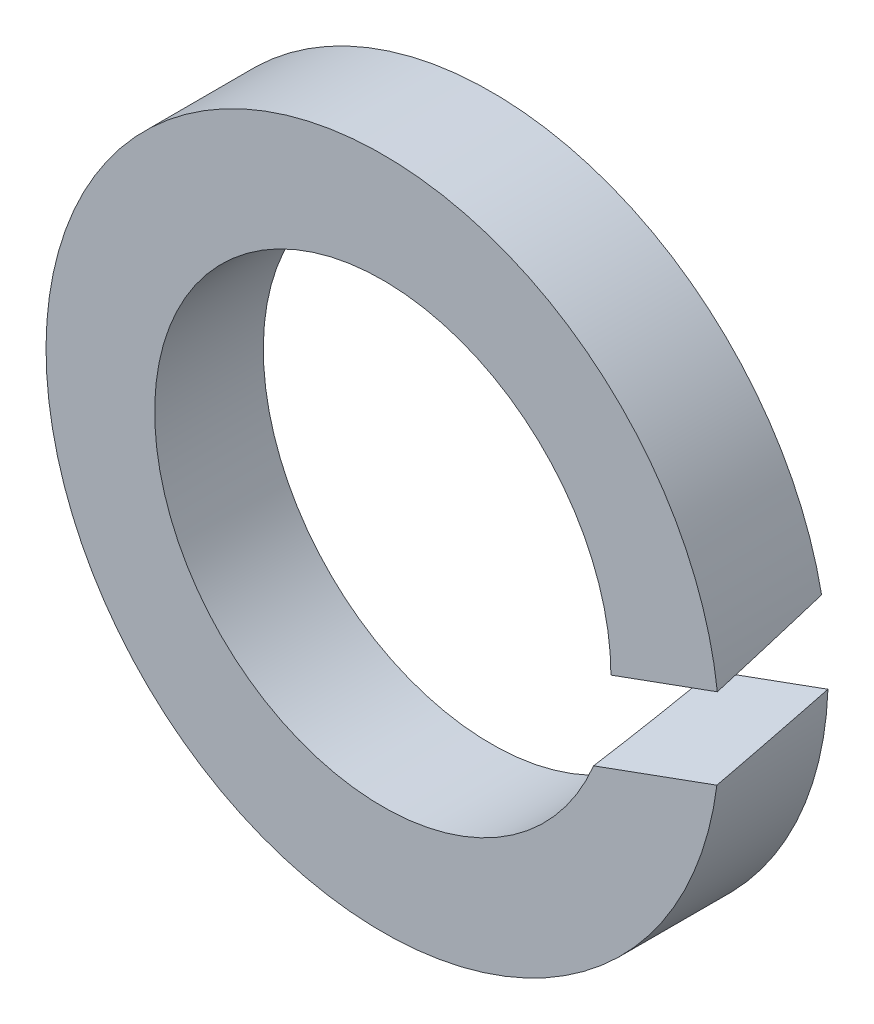
ISO-10303-21;
HEADER;
FILE_DESCRIPTION(('STEP AP214'),'2;1');
FILE_NAME('part.step','',(''),(''),'','','');
FILE_SCHEMA(('AUTOMOTIVE_DESIGN { 1 0 10303 214 1 1 1 1 }'));
ENDSEC;
DATA;
#1=APPLICATION_CONTEXT('core data for automotive mechanical design processes');
#2=APPLICATION_PROTOCOL_DEFINITION('international standard','automotive_design',2000,#1);
#3=PRODUCT_CONTEXT('',#1,'mechanical');
#4=PRODUCT('Part','Part','',(#3));
#5=PRODUCT_RELATED_PRODUCT_CATEGORY('part','',(#4));
#6=PRODUCT_DEFINITION_FORMATION('','',#4);
#7=PRODUCT_DEFINITION_CONTEXT('part definition',#1,'design');
#8=PRODUCT_DEFINITION('design','',#6,#7);
#9=PRODUCT_DEFINITION_SHAPE('','',#8);
#10=(LENGTH_UNIT() NAMED_UNIT(*) SI_UNIT(.MILLI.,.METRE.));
#11=(NAMED_UNIT(*) PLANE_ANGLE_UNIT() SI_UNIT($,.RADIAN.));
#12=(NAMED_UNIT(*) SI_UNIT($,.STERADIAN.) SOLID_ANGLE_UNIT());
#13=UNCERTAINTY_MEASURE_WITH_UNIT(LENGTH_MEASURE(1.E-05),#10,'distance_accuracy_value','');
#14=(GEOMETRIC_REPRESENTATION_CONTEXT(3) GLOBAL_UNCERTAINTY_ASSIGNED_CONTEXT((#13)) GLOBAL_UNIT_ASSIGNED_CONTEXT((#10,
#11,#12)) REPRESENTATION_CONTEXT('',''));
#15=CARTESIAN_POINT('',(0.,0.,0.));
#16=DIRECTION('',(0.,0.,1.));
#17=DIRECTION('',(1.,0.,0.));
#18=AXIS2_PLACEMENT_3D('',#15,#16,#17);
#19=CARTESIAN_POINT('',(-3.33066907387547E-13,1.55,0.));
#20=DIRECTION('',(0.,0.,-1.));
#21=DIRECTION('',(-1.,0.,0.));
#22=AXIS2_PLACEMENT_3D('',#19,#20,#21);
#23=PLANE('',#22);
#24=CARTESIAN_POINT('',(-3.33066907387547E-13,0.,0.));
#25=DIRECTION('',(0.,0.,1.));
#26=DIRECTION('',(1.,0.,0.));
#27=AXIS2_PLACEMENT_3D('',#24,#25,#26);
#28=CIRCLE('',#27,1.05);
#29=CARTESIAN_POINT('',(1.04999999999966,0.,1.2490009027033E-13));
#30=VERTEX_POINT('',#29);
#31=CARTESIAN_POINT('',(0.970202459009251,-0.401506150054715,0.));
#32=VERTEX_POINT('',#31);
#33=EDGE_CURVE('E76',#30,#32,#28,.T.);
#34=ORIENTED_EDGE('',*,*,#33,.F.);
#35=DIRECTION('',(-0.939692620785907,-0.34202014332567,0.));
#36=VECTOR('',#35,1.);
#37=CARTESIAN_POINT('',(0.85049540884527,-0.072613732779649,1.2490009027033E-13));
#38=LINE('',#37,#36);
#39=CARTESIAN_POINT('',(1.53971737478512,0.178242547624892,1.2490009027033E-13));
#40=VERTEX_POINT('',#39);
#41=EDGE_CURVE('E79',#40,#30,#38,.T.);
#42=ORIENTED_EDGE('',*,*,#41,.F.);
#43=CARTESIAN_POINT('',(-3.33066907387547E-13,0.,0.));
#44=DIRECTION('',(0.,0.,1.));
#45=DIRECTION('',(1.,0.,0.));
#46=AXIS2_PLACEMENT_3D('',#43,#44,#45);
#47=CIRCLE('',#46,1.55);
#48=CARTESIAN_POINT('',(1.53769034332821,-0.19495745185591,1.2490009027033E-13));
#49=VERTEX_POINT('',#48);
#50=EDGE_CURVE('E78',#40,#49,#47,.T.);
#51=ORIENTED_EDGE('',*,*,#50,.T.);
#52=DIRECTION('',(0.939692620785907,0.34202014332567,0.));
#53=VECTOR('',#52,1.);
#54=CARTESIAN_POINT('',(0.970202459009251,-0.401506150054715,0.));
#55=LINE('',#54,#53);
#56=EDGE_CURVE('E47',#32,#49,#55,.T.);
#57=ORIENTED_EDGE('',*,*,#56,.F.);
#58=EDGE_LOOP('',(#34,#42,#51,#57));
#59=FACE_BOUND('',#58,.T.);
#60=ADVANCED_FACE('F26',(#59),#23,.F.);
#61=CARTESIAN_POINT('',(-3.33066907387547E-13,0.,0.));
#62=DIRECTION('',(0.,0.,1.));
#63=DIRECTION('',(1.,0.,0.));
#64=AXIS2_PLACEMENT_3D('',#61,#62,#63);
#65=CYLINDRICAL_SURFACE('',#64,1.05);
#66=CARTESIAN_POINT('',(-3.33066907387547E-13,0.,-0.499999999999959));
#67=DIRECTION('',(0.,0.,1.));
#68=DIRECTION('',(1.,0.,0.));
#69=AXIS2_PLACEMENT_3D('',#66,#67,#68);
#70=CIRCLE('',#69,1.05);
#71=CARTESIAN_POINT('',(1.04179741588514,0.130989099753814,-0.499999999999876));
#72=VERTEX_POINT('',#71);
#73=CARTESIAN_POINT('',(1.0199441893691,-0.249427044587275,-0.499999999999959));
#74=VERTEX_POINT('',#73);
#75=EDGE_CURVE('E84',#72,#74,#70,.T.);
#76=ORIENTED_EDGE('',*,*,#75,.F.);
#77=CARTESIAN_POINT('',(-3.33066907387547E-13,1.66967134562768E-13,-1.42627317706038));
#78=DIRECTION('',(-0.331668125174645,0.911250684670167,0.244168885059673));
#79=DIRECTION('',(0.0835106770637852,-0.229443699516116,0.969732723779456));
#80=AXIS2_PLACEMENT_3D('',#77,#78,#79);
#81=ELLIPSE('',#80,4.30030222623716,1.05);
#82=EDGE_CURVE('E83',#72,#30,#81,.F.);
#83=ORIENTED_EDGE('',*,*,#82,.T.);
#84=ORIENTED_EDGE('',*,*,#33,.T.);
#85=CARTESIAN_POINT('',(-3.33066907387547E-13,0.,-2.81632110736831));
#86=DIRECTION('',(0.331668125174645,-0.911250684670167,-0.244168885059673));
#87=DIRECTION('',(0.0835106770637852,-0.229443699516116,0.969732723779456));
#88=AXIS2_PLACEMENT_3D('',#85,#86,#87);
#89=ELLIPSE('',#88,4.30030222623716,1.05);
#90=EDGE_CURVE('E63',#32,#74,#89,.F.);
#91=ORIENTED_EDGE('',*,*,#90,.T.);
#92=EDGE_LOOP('',(#76,#83,#84,#91));
#93=FACE_BOUND('',#92,.T.);
#94=ADVANCED_FACE('F82',(#93),#65,.F.);
#95=CARTESIAN_POINT('',(-3.33066907387547E-13,1.55,-0.499999999999959));
#96=DIRECTION('',(0.,0.,1.));
#97=DIRECTION('',(1.,0.,0.));
#98=AXIS2_PLACEMENT_3D('',#95,#96,#97);
#99=PLANE('',#98);
#100=CARTESIAN_POINT('',(-3.33066907387547E-13,0.,-0.499999999999959));
#101=DIRECTION('',(0.,0.,1.));
#102=DIRECTION('',(1.,0.,0.));
#103=AXIS2_PLACEMENT_3D('',#100,#101,#102);
#104=CIRCLE('',#103,1.55);
#105=CARTESIAN_POINT('',(1.51970881282634,0.304934622856994,-0.499999999999876));
#106=VERTEX_POINT('',#105);
#107=CARTESIAN_POINT('',(1.54895589928802,-0.0568825285985138,-0.499999999999876));
#108=VERTEX_POINT('',#107);
#109=EDGE_CURVE('E86',#106,#108,#104,.T.);
#110=ORIENTED_EDGE('',*,*,#109,.F.);
#111=DIRECTION('',(-0.939692620785907,-0.34202014332567,0.));
#112=VECTOR('',#111,1.);
#113=CARTESIAN_POINT('',(0.577928459639221,-0.0378453929198372,-0.499999999999876));
#114=LINE('',#113,#112);
#115=EDGE_CURVE('E40',#106,#72,#114,.T.);
#116=ORIENTED_EDGE('',*,*,#115,.T.);
#117=ORIENTED_EDGE('',*,*,#75,.T.);
#118=DIRECTION('',(0.939692620785907,0.34202014332567,0.));
#119=VECTOR('',#118,1.);
#120=CARTESIAN_POINT('',(0.697635509803202,-0.366737810194903,-0.499999999999959));
#121=LINE('',#120,#119);
#122=EDGE_CURVE('E66',#74,#108,#121,.T.);
#123=ORIENTED_EDGE('',*,*,#122,.T.);
#124=EDGE_LOOP('',(#110,#116,#117,#123));
#125=FACE_BOUND('',#124,.T.);
#126=ADVANCED_FACE('F100',(#125),#99,.F.);
#127=CARTESIAN_POINT('',(-3.33066907387547E-13,0.,0.));
#128=DIRECTION('',(0.,0.,1.));
#129=DIRECTION('',(1.,0.,0.));
#130=AXIS2_PLACEMENT_3D('',#127,#128,#129);
#131=CYLINDRICAL_SURFACE('',#130,1.55);
#132=ORIENTED_EDGE('',*,*,#50,.F.);
#133=CARTESIAN_POINT('',(-3.33066907387547E-13,1.66967134562768E-13,-1.42627317706038));
#134=DIRECTION('',(-0.331668125174645,0.911250684670167,0.244168885059673));
#135=DIRECTION('',(0.0835106770637852,-0.229443699516116,0.969732723779456));
#136=AXIS2_PLACEMENT_3D('',#133,#134,#135);
#137=ELLIPSE('',#136,6.34806519111199,1.55);
#138=EDGE_CURVE('E11',#40,#106,#137,.T.);
#139=ORIENTED_EDGE('',*,*,#138,.T.);
#140=ORIENTED_EDGE('',*,*,#109,.T.);
#141=CARTESIAN_POINT('',(-3.33066907387547E-13,0.,-2.81632110736831));
#142=DIRECTION('',(0.331668125174645,-0.911250684670167,-0.244168885059673));
#143=DIRECTION('',(0.0835106770637852,-0.229443699516116,0.969732723779456));
#144=AXIS2_PLACEMENT_3D('',#141,#142,#143);
#145=ELLIPSE('',#144,6.34806519111199,1.55);
#146=EDGE_CURVE('E33',#108,#49,#145,.T.);
#147=ORIENTED_EDGE('',*,*,#146,.T.);
#148=EDGE_LOOP('',(#132,#139,#140,#147));
#149=FACE_BOUND('',#148,.T.);
#150=ADVANCED_FACE('F97',(#149),#131,.T.);
#151=CARTESIAN_POINT('',(0.970202459009251,4.95747769856815,-19.9999999999999));
#152=DIRECTION('',(0.331668125174645,-0.911250684670167,-0.244168885059673));
#153=DIRECTION('',(0.939692620785907,0.34202014332567,0.));
#154=AXIS2_PLACEMENT_3D('',#151,#152,#153);
#155=PLANE('',#154);
#156=ORIENTED_EDGE('',*,*,#56,.T.);
#157=ORIENTED_EDGE('',*,*,#146,.F.);
#158=ORIENTED_EDGE('',*,*,#122,.F.);
#159=ORIENTED_EDGE('',*,*,#90,.F.);
#160=EDGE_LOOP('',(#156,#157,#158,#159));
#161=FACE_BOUND('',#160,.T.);
#162=ADVANCED_FACE('F64',(#161),#155,.F.);
#163=CARTESIAN_POINT('',(0.85049540884527,5.28637011584323,-20.0000000000001));
#164=DIRECTION('',(-0.331668125174645,0.911250684670167,0.244168885059673));
#165=DIRECTION('',(-0.939692620785907,-0.34202014332567,0.));
#166=AXIS2_PLACEMENT_3D('',#163,#164,#165);
#167=PLANE('',#166);
#168=ORIENTED_EDGE('',*,*,#115,.F.);
#169=ORIENTED_EDGE('',*,*,#138,.F.);
#170=ORIENTED_EDGE('',*,*,#41,.T.);
#171=ORIENTED_EDGE('',*,*,#82,.F.);
#172=EDGE_LOOP('',(#168,#169,#170,#171));
#173=FACE_BOUND('',#172,.T.);
#174=ADVANCED_FACE('F95',(#173),#167,.F.);
#175=CLOSED_SHELL('',(#60,#94,#126,#150,#162,#174));
#176=MANIFOLD_SOLID_BREP('B2',#175);
#177=ADVANCED_BREP_SHAPE_REPRESENTATION('',(#18,#176),#14);
#178=SHAPE_DEFINITION_REPRESENTATION(#9,#177);
ENDSEC;
END-ISO-10303-21;
